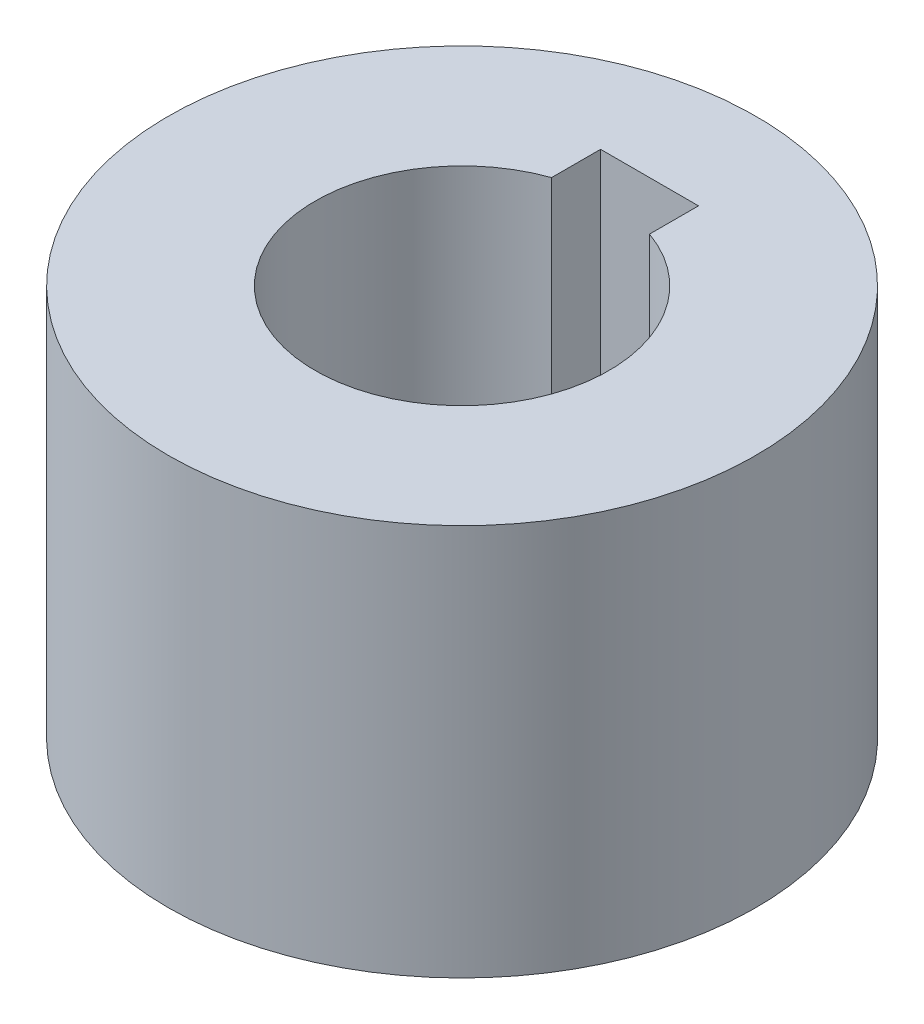
ISO-10303-21;
HEADER;
FILE_DESCRIPTION(('STEP AP214'),'2;1');
FILE_NAME('part.step','',(''),(''),'','','');
FILE_SCHEMA(('AUTOMOTIVE_DESIGN { 1 0 10303 214 1 1 1 1 }'));
ENDSEC;
DATA;
#1=APPLICATION_CONTEXT('core data for automotive mechanical design processes');
#2=APPLICATION_PROTOCOL_DEFINITION('international standard','automotive_design',2000,#1);
#3=PRODUCT_CONTEXT('',#1,'mechanical');
#4=PRODUCT('Part','Part','',(#3));
#5=PRODUCT_RELATED_PRODUCT_CATEGORY('part','',(#4));
#6=PRODUCT_DEFINITION_FORMATION('','',#4);
#7=PRODUCT_DEFINITION_CONTEXT('part definition',#1,'design');
#8=PRODUCT_DEFINITION('design','',#6,#7);
#9=PRODUCT_DEFINITION_SHAPE('','',#8);
#10=(LENGTH_UNIT() NAMED_UNIT(*) SI_UNIT(.MILLI.,.METRE.));
#11=(NAMED_UNIT(*) PLANE_ANGLE_UNIT() SI_UNIT($,.RADIAN.));
#12=(NAMED_UNIT(*) SI_UNIT($,.STERADIAN.) SOLID_ANGLE_UNIT());
#13=UNCERTAINTY_MEASURE_WITH_UNIT(LENGTH_MEASURE(1.E-05),#10,'distance_accuracy_value','');
#14=(GEOMETRIC_REPRESENTATION_CONTEXT(3) GLOBAL_UNCERTAINTY_ASSIGNED_CONTEXT((#13)) GLOBAL_UNIT_ASSIGNED_CONTEXT((#10,
#11,#12)) REPRESENTATION_CONTEXT('',''));
#15=CARTESIAN_POINT('',(0.,0.,0.));
#16=DIRECTION('',(0.,0.,1.));
#17=DIRECTION('',(1.,0.,0.));
#18=AXIS2_PLACEMENT_3D('',#15,#16,#17);
#19=CARTESIAN_POINT('',(0.,20.,0.));
#20=DIRECTION('',(0.,1.,0.));
#21=DIRECTION('',(0.,0.,1.));
#22=AXIS2_PLACEMENT_3D('',#19,#20,#21);
#23=PLANE('',#22);
#24=CARTESIAN_POINT('',(0.,20.,0.));
#25=DIRECTION('',(0.,1.,0.));
#26=DIRECTION('',(0.,0.,1.));
#27=AXIS2_PLACEMENT_3D('',#24,#25,#26);
#28=CIRCLE('',#27,15.);
#29=CARTESIAN_POINT('',(0.,20.,15.));
#30=VERTEX_POINT('',#29);
#31=EDGE_CURVE('E11',#30,#30,#28,.T.);
#32=ORIENTED_EDGE('',*,*,#31,.T.);
#33=EDGE_LOOP('',(#32));
#34=FACE_BOUND('',#33,.T.);
#35=DIRECTION('',(0.,0.,-1.));
#36=VECTOR('',#35,1.);
#37=CARTESIAN_POINT('',(2.5,20.,-7.07106781186548));
#38=LINE('',#37,#36);
#39=CARTESIAN_POINT('',(2.5,20.,-7.07106781186548));
#40=VERTEX_POINT('',#39);
#41=CARTESIAN_POINT('',(2.5,20.,-9.57106781186548));
#42=VERTEX_POINT('',#41);
#43=EDGE_CURVE('E94',#40,#42,#38,.T.);
#44=ORIENTED_EDGE('',*,*,#43,.F.);
#45=CARTESIAN_POINT('',(0.,20.,0.));
#46=DIRECTION('',(0.,1.,0.));
#47=DIRECTION('',(0.,0.,1.));
#48=AXIS2_PLACEMENT_3D('',#45,#46,#47);
#49=CIRCLE('',#48,7.5);
#50=CARTESIAN_POINT('',(-2.5,20.,-7.07106781186548));
#51=VERTEX_POINT('',#50);
#52=EDGE_CURVE('E85',#51,#40,#49,.T.);
#53=ORIENTED_EDGE('',*,*,#52,.F.);
#54=DIRECTION('',(0.,0.,1.));
#55=VECTOR('',#54,1.);
#56=CARTESIAN_POINT('',(-2.5,20.,-9.57106781186548));
#57=LINE('',#56,#55);
#58=CARTESIAN_POINT('',(-2.5,20.,-9.57106781186548));
#59=VERTEX_POINT('',#58);
#60=EDGE_CURVE('E111',#59,#51,#57,.T.);
#61=ORIENTED_EDGE('',*,*,#60,.F.);
#62=DIRECTION('',(-1.,0.,0.));
#63=VECTOR('',#62,1.);
#64=CARTESIAN_POINT('',(2.5,20.,-9.57106781186548));
#65=LINE('',#64,#63);
#66=EDGE_CURVE('E106',#42,#59,#65,.T.);
#67=ORIENTED_EDGE('',*,*,#66,.F.);
#68=EDGE_LOOP('',(#44,#53,#61,#67));
#69=FACE_BOUND('',#68,.T.);
#70=ADVANCED_FACE('F43',(#34,#69),#23,.T.);
#71=CARTESIAN_POINT('',(0.,0.,0.));
#72=DIRECTION('',(0.,1.,0.));
#73=DIRECTION('',(0.,0.,1.));
#74=AXIS2_PLACEMENT_3D('',#71,#72,#73);
#75=PLANE('',#74);
#76=CARTESIAN_POINT('',(0.,0.,0.));
#77=DIRECTION('',(0.,1.,0.));
#78=DIRECTION('',(0.,0.,1.));
#79=AXIS2_PLACEMENT_3D('',#76,#77,#78);
#80=CIRCLE('',#79,15.);
#81=CARTESIAN_POINT('',(0.,0.,15.));
#82=VERTEX_POINT('',#81);
#83=EDGE_CURVE('E47',#82,#82,#80,.T.);
#84=ORIENTED_EDGE('',*,*,#83,.F.);
#85=EDGE_LOOP('',(#84));
#86=FACE_BOUND('',#85,.T.);
#87=CARTESIAN_POINT('',(0.,0.,0.));
#88=DIRECTION('',(0.,1.,0.));
#89=DIRECTION('',(0.,0.,1.));
#90=AXIS2_PLACEMENT_3D('',#87,#88,#89);
#91=CIRCLE('',#90,7.5);
#92=CARTESIAN_POINT('',(-2.5,0.,-7.07106781186548));
#93=VERTEX_POINT('',#92);
#94=CARTESIAN_POINT('',(2.5,0.,-7.07106781186548));
#95=VERTEX_POINT('',#94);
#96=EDGE_CURVE('E67',#93,#95,#91,.T.);
#97=ORIENTED_EDGE('',*,*,#96,.T.);
#98=DIRECTION('',(0.,0.,-1.));
#99=VECTOR('',#98,1.);
#100=CARTESIAN_POINT('',(2.5,0.,-7.07106781186548));
#101=LINE('',#100,#99);
#102=CARTESIAN_POINT('',(2.5,0.,-9.57106781186548));
#103=VERTEX_POINT('',#102);
#104=EDGE_CURVE('E101',#95,#103,#101,.T.);
#105=ORIENTED_EDGE('',*,*,#104,.T.);
#106=DIRECTION('',(-1.,0.,0.));
#107=VECTOR('',#106,1.);
#108=CARTESIAN_POINT('',(2.5,0.,-9.57106781186548));
#109=LINE('',#108,#107);
#110=CARTESIAN_POINT('',(-2.5,0.,-9.57106781186548));
#111=VERTEX_POINT('',#110);
#112=EDGE_CURVE('E120',#103,#111,#109,.T.);
#113=ORIENTED_EDGE('',*,*,#112,.T.);
#114=DIRECTION('',(0.,0.,1.));
#115=VECTOR('',#114,1.);
#116=CARTESIAN_POINT('',(-2.5,0.,-9.57106781186548));
#117=LINE('',#116,#115);
#118=EDGE_CURVE('E95',#111,#93,#117,.T.);
#119=ORIENTED_EDGE('',*,*,#118,.T.);
#120=EDGE_LOOP('',(#97,#105,#113,#119));
#121=FACE_BOUND('',#120,.T.);
#122=ADVANCED_FACE('F137',(#86,#121),#75,.F.);
#123=CARTESIAN_POINT('',(0.,20.,0.));
#124=DIRECTION('',(0.,-1.,0.));
#125=DIRECTION('',(0.,0.,-1.));
#126=AXIS2_PLACEMENT_3D('',#123,#124,#125);
#127=CYLINDRICAL_SURFACE('',#126,15.);
#128=ORIENTED_EDGE('',*,*,#31,.F.);
#129=EDGE_LOOP('',(#128));
#130=FACE_BOUND('',#129,.T.);
#131=ORIENTED_EDGE('',*,*,#83,.T.);
#132=EDGE_LOOP('',(#131));
#133=FACE_BOUND('',#132,.T.);
#134=ADVANCED_FACE('F45',(#130,#133),#127,.T.);
#135=CARTESIAN_POINT('',(0.,20.,0.));
#136=DIRECTION('',(0.,-1.,0.));
#137=DIRECTION('',(0.,0.,-1.));
#138=AXIS2_PLACEMENT_3D('',#135,#136,#137);
#139=CYLINDRICAL_SURFACE('',#138,7.5);
#140=ORIENTED_EDGE('',*,*,#96,.F.);
#141=DIRECTION('',(0.,-1.,0.));
#142=VECTOR('',#141,1.);
#143=CARTESIAN_POINT('',(-2.5,20.,-7.07106781186548));
#144=LINE('',#143,#142);
#145=EDGE_CURVE('E89',#51,#93,#144,.T.);
#146=ORIENTED_EDGE('',*,*,#145,.F.);
#147=ORIENTED_EDGE('',*,*,#52,.T.);
#148=DIRECTION('',(0.,-1.,0.));
#149=VECTOR('',#148,1.);
#150=CARTESIAN_POINT('',(2.5,20.,-7.07106781186548));
#151=LINE('',#150,#149);
#152=EDGE_CURVE('E88',#40,#95,#151,.T.);
#153=ORIENTED_EDGE('',*,*,#152,.T.);
#154=EDGE_LOOP('',(#140,#146,#147,#153));
#155=FACE_BOUND('',#154,.T.);
#156=ADVANCED_FACE('F87',(#155),#139,.F.);
#157=CARTESIAN_POINT('',(2.5,20.,-7.07106781186548));
#158=DIRECTION('',(-1.,0.,0.));
#159=DIRECTION('',(0.,0.,1.));
#160=AXIS2_PLACEMENT_3D('',#157,#158,#159);
#161=PLANE('',#160);
#162=ORIENTED_EDGE('',*,*,#104,.F.);
#163=ORIENTED_EDGE('',*,*,#152,.F.);
#164=ORIENTED_EDGE('',*,*,#43,.T.);
#165=DIRECTION('',(0.,-1.,0.));
#166=VECTOR('',#165,1.);
#167=CARTESIAN_POINT('',(2.5,20.,-9.57106781186548));
#168=LINE('',#167,#166);
#169=EDGE_CURVE('E103',#42,#103,#168,.T.);
#170=ORIENTED_EDGE('',*,*,#169,.T.);
#171=EDGE_LOOP('',(#162,#163,#164,#170));
#172=FACE_BOUND('',#171,.T.);
#173=ADVANCED_FACE('F98',(#172),#161,.T.);
#174=CARTESIAN_POINT('',(2.5,20.,-9.57106781186548));
#175=DIRECTION('',(0.,0.,1.));
#176=DIRECTION('',(1.,0.,0.));
#177=AXIS2_PLACEMENT_3D('',#174,#175,#176);
#178=PLANE('',#177);
#179=ORIENTED_EDGE('',*,*,#112,.F.);
#180=ORIENTED_EDGE('',*,*,#169,.F.);
#181=ORIENTED_EDGE('',*,*,#66,.T.);
#182=DIRECTION('',(0.,-1.,0.));
#183=VECTOR('',#182,1.);
#184=CARTESIAN_POINT('',(-2.5,20.,-9.57106781186548));
#185=LINE('',#184,#183);
#186=EDGE_CURVE('E59',#59,#111,#185,.T.);
#187=ORIENTED_EDGE('',*,*,#186,.T.);
#188=EDGE_LOOP('',(#179,#180,#181,#187));
#189=FACE_BOUND('',#188,.T.);
#190=ADVANCED_FACE('F135',(#189),#178,.T.);
#191=CARTESIAN_POINT('',(-2.5,20.,-9.57106781186548));
#192=DIRECTION('',(1.,0.,0.));
#193=DIRECTION('',(0.,0.,-1.));
#194=AXIS2_PLACEMENT_3D('',#191,#192,#193);
#195=PLANE('',#194);
#196=ORIENTED_EDGE('',*,*,#118,.F.);
#197=ORIENTED_EDGE('',*,*,#186,.F.);
#198=ORIENTED_EDGE('',*,*,#60,.T.);
#199=ORIENTED_EDGE('',*,*,#145,.T.);
#200=EDGE_LOOP('',(#196,#197,#198,#199));
#201=FACE_BOUND('',#200,.T.);
#202=ADVANCED_FACE('F138',(#201),#195,.T.);
#203=CLOSED_SHELL('',(#70,#122,#134,#156,#173,#190,#202));
#204=MANIFOLD_SOLID_BREP('B2',#203);
#205=ADVANCED_BREP_SHAPE_REPRESENTATION('',(#18,#204),#14);
#206=SHAPE_DEFINITION_REPRESENTATION(#9,#205);
ENDSEC;
END-ISO-10303-21;
